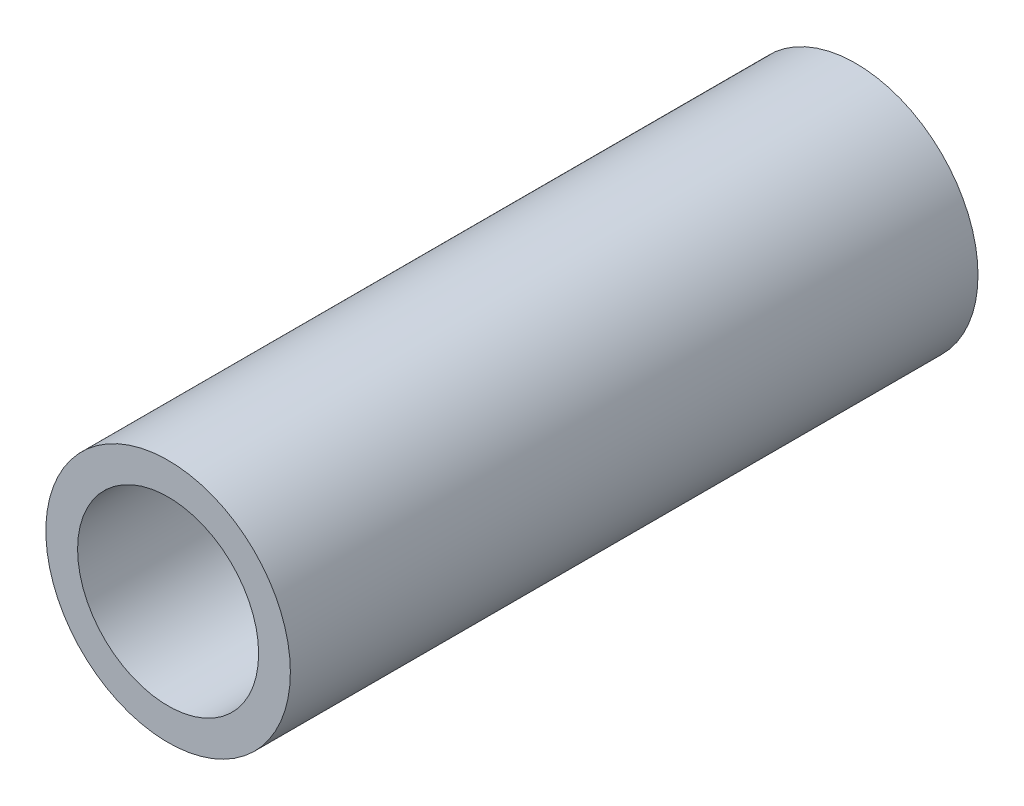
ISO-10303-21;
HEADER;
FILE_DESCRIPTION(('STEP AP214'),'2;1');
FILE_NAME('part.step','',(''),(''),'','','');
FILE_SCHEMA(('AUTOMOTIVE_DESIGN { 1 0 10303 214 1 1 1 1 }'));
ENDSEC;
DATA;
#1=APPLICATION_CONTEXT('core data for automotive mechanical design processes');
#2=APPLICATION_PROTOCOL_DEFINITION('international standard','automotive_design',2000,#1);
#3=PRODUCT_CONTEXT('',#1,'mechanical');
#4=PRODUCT('Part','Part','',(#3));
#5=PRODUCT_RELATED_PRODUCT_CATEGORY('part','',(#4));
#6=PRODUCT_DEFINITION_FORMATION('','',#4);
#7=PRODUCT_DEFINITION_CONTEXT('part definition',#1,'design');
#8=PRODUCT_DEFINITION('design','',#6,#7);
#9=PRODUCT_DEFINITION_SHAPE('','',#8);
#10=(LENGTH_UNIT() NAMED_UNIT(*) SI_UNIT(.MILLI.,.METRE.));
#11=(NAMED_UNIT(*) PLANE_ANGLE_UNIT() SI_UNIT($,.RADIAN.));
#12=(NAMED_UNIT(*) SI_UNIT($,.STERADIAN.) SOLID_ANGLE_UNIT());
#13=UNCERTAINTY_MEASURE_WITH_UNIT(LENGTH_MEASURE(1.E-05),#10,'distance_accuracy_value','');
#14=(GEOMETRIC_REPRESENTATION_CONTEXT(3) GLOBAL_UNCERTAINTY_ASSIGNED_CONTEXT((#13)) GLOBAL_UNIT_ASSIGNED_CONTEXT((#10,
#11,#12)) REPRESENTATION_CONTEXT('',''));
#15=CARTESIAN_POINT('',(0.,0.,0.));
#16=DIRECTION('',(0.,0.,1.));
#17=DIRECTION('',(1.,0.,0.));
#18=AXIS2_PLACEMENT_3D('',#15,#16,#17);
#19=CARTESIAN_POINT('',(0.,0.,30.));
#20=DIRECTION('',(0.,0.,1.));
#21=DIRECTION('',(1.,0.,0.));
#22=AXIS2_PLACEMENT_3D('',#19,#20,#21);
#23=PLANE('',#22);
#24=CARTESIAN_POINT('',(0.,0.,30.));
#25=DIRECTION('',(0.,0.,1.));
#26=DIRECTION('',(1.,0.,0.));
#27=AXIS2_PLACEMENT_3D('',#24,#25,#26);
#28=CIRCLE('',#27,10.668);
#29=CARTESIAN_POINT('',(10.668,0.,30.));
#30=VERTEX_POINT('',#29);
#31=EDGE_CURVE('E11',#30,#30,#28,.T.);
#32=ORIENTED_EDGE('',*,*,#31,.T.);
#33=EDGE_LOOP('',(#32));
#34=FACE_BOUND('',#33,.T.);
#35=CARTESIAN_POINT('',(0.,0.,30.));
#36=DIRECTION('',(0.,0.,1.));
#37=DIRECTION('',(1.,0.,0.));
#38=AXIS2_PLACEMENT_3D('',#35,#36,#37);
#39=CIRCLE('',#38,7.8994);
#40=CARTESIAN_POINT('',(7.8994,0.,30.));
#41=VERTEX_POINT('',#40);
#42=EDGE_CURVE('E56',#41,#41,#39,.T.);
#43=ORIENTED_EDGE('',*,*,#42,.F.);
#44=EDGE_LOOP('',(#43));
#45=FACE_BOUND('',#44,.T.);
#46=ADVANCED_FACE('F43',(#34,#45),#23,.T.);
#47=CARTESIAN_POINT('',(0.,0.,-30.));
#48=DIRECTION('',(0.,0.,1.));
#49=DIRECTION('',(1.,0.,0.));
#50=AXIS2_PLACEMENT_3D('',#47,#48,#49);
#51=PLANE('',#50);
#52=CARTESIAN_POINT('',(0.,0.,-30.));
#53=DIRECTION('',(0.,0.,1.));
#54=DIRECTION('',(1.,0.,0.));
#55=AXIS2_PLACEMENT_3D('',#52,#53,#54);
#56=CIRCLE('',#55,10.668);
#57=CARTESIAN_POINT('',(10.668,0.,-30.));
#58=VERTEX_POINT('',#57);
#59=EDGE_CURVE('E47',#58,#58,#56,.T.);
#60=ORIENTED_EDGE('',*,*,#59,.F.);
#61=EDGE_LOOP('',(#60));
#62=FACE_BOUND('',#61,.T.);
#63=CARTESIAN_POINT('',(0.,0.,-30.));
#64=DIRECTION('',(0.,0.,1.));
#65=DIRECTION('',(1.,0.,0.));
#66=AXIS2_PLACEMENT_3D('',#63,#64,#65);
#67=CIRCLE('',#66,7.8994);
#68=CARTESIAN_POINT('',(7.8994,0.,-30.));
#69=VERTEX_POINT('',#68);
#70=EDGE_CURVE('E58',#69,#69,#67,.T.);
#71=ORIENTED_EDGE('',*,*,#70,.T.);
#72=EDGE_LOOP('',(#71));
#73=FACE_BOUND('',#72,.T.);
#74=ADVANCED_FACE('F70',(#62,#73),#51,.F.);
#75=CARTESIAN_POINT('',(0.,0.,30.));
#76=DIRECTION('',(0.,0.,-1.));
#77=DIRECTION('',(-1.,0.,0.));
#78=AXIS2_PLACEMENT_3D('',#75,#76,#77);
#79=CYLINDRICAL_SURFACE('',#78,10.668);
#80=ORIENTED_EDGE('',*,*,#31,.F.);
#81=EDGE_LOOP('',(#80));
#82=FACE_BOUND('',#81,.T.);
#83=ORIENTED_EDGE('',*,*,#59,.T.);
#84=EDGE_LOOP('',(#83));
#85=FACE_BOUND('',#84,.T.);
#86=ADVANCED_FACE('F45',(#82,#85),#79,.T.);
#87=CARTESIAN_POINT('',(0.,0.,30.));
#88=DIRECTION('',(0.,0.,-1.));
#89=DIRECTION('',(-1.,0.,0.));
#90=AXIS2_PLACEMENT_3D('',#87,#88,#89);
#91=CYLINDRICAL_SURFACE('',#90,7.8994);
#92=ORIENTED_EDGE('',*,*,#42,.T.);
#93=EDGE_LOOP('',(#92));
#94=FACE_BOUND('',#93,.T.);
#95=ORIENTED_EDGE('',*,*,#70,.F.);
#96=EDGE_LOOP('',(#95));
#97=FACE_BOUND('',#96,.T.);
#98=ADVANCED_FACE('F66',(#94,#97),#91,.F.);
#99=CLOSED_SHELL('',(#46,#74,#86,#98));
#100=MANIFOLD_SOLID_BREP('B2',#99);
#101=ADVANCED_BREP_SHAPE_REPRESENTATION('',(#18,#100),#14);
#102=SHAPE_DEFINITION_REPRESENTATION(#9,#101);
ENDSEC;
END-ISO-10303-21;
